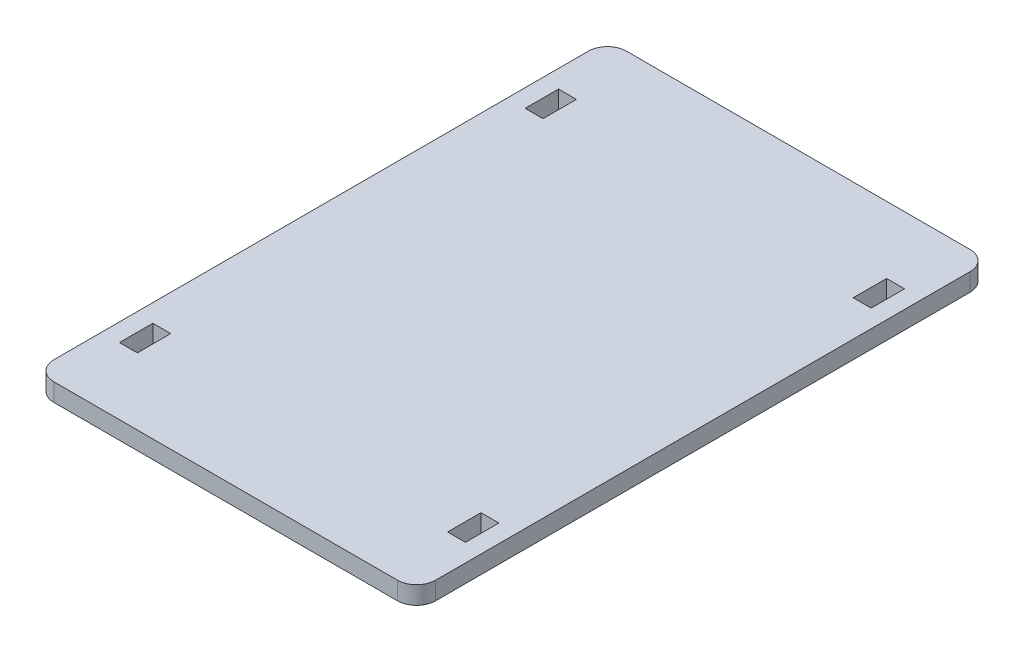
ISO-10303-21;
HEADER;
FILE_DESCRIPTION(('STEP AP214'),'2;1');
FILE_NAME('part.step','',(''),(''),'','','');
FILE_SCHEMA(('AUTOMOTIVE_DESIGN { 1 0 10303 214 1 1 1 1 }'));
ENDSEC;
DATA;
#1=APPLICATION_CONTEXT('core data for automotive mechanical design processes');
#2=APPLICATION_PROTOCOL_DEFINITION('international standard','automotive_design',2000,#1);
#3=PRODUCT_CONTEXT('',#1,'mechanical');
#4=PRODUCT('Part','Part','',(#3));
#5=PRODUCT_RELATED_PRODUCT_CATEGORY('part','',(#4));
#6=PRODUCT_DEFINITION_FORMATION('','',#4);
#7=PRODUCT_DEFINITION_CONTEXT('part definition',#1,'design');
#8=PRODUCT_DEFINITION('design','',#6,#7);
#9=PRODUCT_DEFINITION_SHAPE('','',#8);
#10=(LENGTH_UNIT() NAMED_UNIT(*) SI_UNIT(.MILLI.,.METRE.));
#11=(NAMED_UNIT(*) PLANE_ANGLE_UNIT() SI_UNIT($,.RADIAN.));
#12=(NAMED_UNIT(*) SI_UNIT($,.STERADIAN.) SOLID_ANGLE_UNIT());
#13=UNCERTAINTY_MEASURE_WITH_UNIT(LENGTH_MEASURE(1.E-05),#10,'distance_accuracy_value','');
#14=(GEOMETRIC_REPRESENTATION_CONTEXT(3) GLOBAL_UNCERTAINTY_ASSIGNED_CONTEXT((#13)) GLOBAL_UNIT_ASSIGNED_CONTEXT((#10,
#11,#12)) REPRESENTATION_CONTEXT('',''));
#15=CARTESIAN_POINT('',(0.,0.,0.));
#16=DIRECTION('',(0.,0.,1.));
#17=DIRECTION('',(1.,0.,0.));
#18=AXIS2_PLACEMENT_3D('',#15,#16,#17);
#19=CARTESIAN_POINT('',(0.,4.7625,0.));
#20=DIRECTION('',(-1.,0.,0.));
#21=DIRECTION('',(0.,0.,1.));
#22=AXIS2_PLACEMENT_3D('',#19,#20,#21);
#23=PLANE('',#22);
#24=DIRECTION('',(0.,0.,-1.));
#25=VECTOR('',#24,1.);
#26=CARTESIAN_POINT('',(0.,0.,0.));
#27=LINE('',#26,#25);
#28=CARTESIAN_POINT('',(0.,0.,-5.08));
#29=VERTEX_POINT('',#28);
#30=CARTESIAN_POINT('',(0.,0.,-147.32));
#31=VERTEX_POINT('',#30);
#32=EDGE_CURVE('E319',#29,#31,#27,.T.);
#33=ORIENTED_EDGE('',*,*,#32,.T.);
#34=DIRECTION('',(0.,-1.,0.));
#35=VECTOR('',#34,1.);
#36=CARTESIAN_POINT('',(0.,4.7625,-147.32));
#37=LINE('',#36,#35);
#38=CARTESIAN_POINT('',(0.,4.7625,-147.32));
#39=VERTEX_POINT('',#38);
#40=EDGE_CURVE('E11',#31,#39,#37,.F.);
#41=ORIENTED_EDGE('',*,*,#40,.T.);
#42=DIRECTION('',(0.,0.,-1.));
#43=VECTOR('',#42,1.);
#44=CARTESIAN_POINT('',(0.,4.7625,0.));
#45=LINE('',#44,#43);
#46=CARTESIAN_POINT('',(0.,4.7625,-5.08));
#47=VERTEX_POINT('',#46);
#48=EDGE_CURVE('E329',#47,#39,#45,.T.);
#49=ORIENTED_EDGE('',*,*,#48,.F.);
#50=DIRECTION('',(0.,-1.,0.));
#51=VECTOR('',#50,1.);
#52=CARTESIAN_POINT('',(0.,0.,-5.08));
#53=LINE('',#52,#51);
#54=EDGE_CURVE('E47',#47,#29,#53,.T.);
#55=ORIENTED_EDGE('',*,*,#54,.T.);
#56=EDGE_LOOP('',(#33,#41,#49,#55));
#57=FACE_BOUND('',#56,.T.);
#58=ADVANCED_FACE('F38',(#57),#23,.F.);
#59=CARTESIAN_POINT('',(0.,4.7625,-152.4));
#60=DIRECTION('',(0.,0.,1.));
#61=DIRECTION('',(1.,0.,0.));
#62=AXIS2_PLACEMENT_3D('',#59,#60,#61);
#63=PLANE('',#62);
#64=DIRECTION('',(-1.,0.,0.));
#65=VECTOR('',#64,1.);
#66=CARTESIAN_POINT('',(0.,0.,-152.4));
#67=LINE('',#66,#65);
#68=CARTESIAN_POINT('',(-5.08,0.,-152.4));
#69=VERTEX_POINT('',#68);
#70=CARTESIAN_POINT('',(-96.52,0.,-152.4));
#71=VERTEX_POINT('',#70);
#72=EDGE_CURVE('E348',#69,#71,#67,.T.);
#73=ORIENTED_EDGE('',*,*,#72,.T.);
#74=DIRECTION('',(0.,-1.,0.));
#75=VECTOR('',#74,1.);
#76=CARTESIAN_POINT('',(-96.52,4.7625,-152.4));
#77=LINE('',#76,#75);
#78=CARTESIAN_POINT('',(-96.52,4.7625,-152.4));
#79=VERTEX_POINT('',#78);
#80=EDGE_CURVE('E54',#71,#79,#77,.F.);
#81=ORIENTED_EDGE('',*,*,#80,.T.);
#82=DIRECTION('',(-1.,0.,0.));
#83=VECTOR('',#82,1.);
#84=CARTESIAN_POINT('',(0.,4.7625,-152.4));
#85=LINE('',#84,#83);
#86=CARTESIAN_POINT('',(-5.08,4.7625,-152.4));
#87=VERTEX_POINT('',#86);
#88=EDGE_CURVE('E332',#87,#79,#85,.T.);
#89=ORIENTED_EDGE('',*,*,#88,.F.);
#90=DIRECTION('',(0.,-1.,0.));
#91=VECTOR('',#90,1.);
#92=CARTESIAN_POINT('',(-5.08,4.7625,-152.4));
#93=LINE('',#92,#91);
#94=EDGE_CURVE('E455',#87,#69,#93,.T.);
#95=ORIENTED_EDGE('',*,*,#94,.T.);
#96=EDGE_LOOP('',(#73,#81,#89,#95));
#97=FACE_BOUND('',#96,.T.);
#98=ADVANCED_FACE('F477',(#97),#63,.F.);
#99=CARTESIAN_POINT('',(-101.6,4.7625,0.));
#100=DIRECTION('',(-1.,0.,0.));
#101=DIRECTION('',(0.,0.,1.));
#102=AXIS2_PLACEMENT_3D('',#99,#100,#101);
#103=PLANE('',#102);
#104=DIRECTION('',(0.,0.,-1.));
#105=VECTOR('',#104,1.);
#106=CARTESIAN_POINT('',(-101.6,0.,0.));
#107=LINE('',#106,#105);
#108=CARTESIAN_POINT('',(-101.6,0.,-5.08));
#109=VERTEX_POINT('',#108);
#110=CARTESIAN_POINT('',(-101.6,0.,-147.32));
#111=VERTEX_POINT('',#110);
#112=EDGE_CURVE('E351',#109,#111,#107,.T.);
#113=ORIENTED_EDGE('',*,*,#112,.F.);
#114=DIRECTION('',(0.,-1.,0.));
#115=VECTOR('',#114,1.);
#116=CARTESIAN_POINT('',(-101.6,4.7625,-5.08));
#117=LINE('',#116,#115);
#118=CARTESIAN_POINT('',(-101.6,4.7625,-5.08));
#119=VERTEX_POINT('',#118);
#120=EDGE_CURVE('E441',#109,#119,#117,.F.);
#121=ORIENTED_EDGE('',*,*,#120,.T.);
#122=DIRECTION('',(0.,0.,-1.));
#123=VECTOR('',#122,1.);
#124=CARTESIAN_POINT('',(-101.6,4.7625,0.));
#125=LINE('',#124,#123);
#126=CARTESIAN_POINT('',(-101.6,4.7625,-147.32));
#127=VERTEX_POINT('',#126);
#128=EDGE_CURVE('E336',#119,#127,#125,.T.);
#129=ORIENTED_EDGE('',*,*,#128,.T.);
#130=DIRECTION('',(0.,-1.,0.));
#131=VECTOR('',#130,1.);
#132=CARTESIAN_POINT('',(-101.6,0.,-147.32));
#133=LINE('',#132,#131);
#134=EDGE_CURVE('E437',#127,#111,#133,.T.);
#135=ORIENTED_EDGE('',*,*,#134,.T.);
#136=EDGE_LOOP('',(#113,#121,#129,#135));
#137=FACE_BOUND('',#136,.T.);
#138=ADVANCED_FACE('F485',(#137),#103,.T.);
#139=CARTESIAN_POINT('',(0.,4.7625,0.));
#140=DIRECTION('',(0.,0.,1.));
#141=DIRECTION('',(1.,0.,0.));
#142=AXIS2_PLACEMENT_3D('',#139,#140,#141);
#143=PLANE('',#142);
#144=DIRECTION('',(-1.,0.,0.));
#145=VECTOR('',#144,1.);
#146=CARTESIAN_POINT('',(0.,4.7625,0.));
#147=LINE('',#146,#145);
#148=CARTESIAN_POINT('',(-5.08,4.7625,0.));
#149=VERTEX_POINT('',#148);
#150=CARTESIAN_POINT('',(-96.52,4.7625,0.));
#151=VERTEX_POINT('',#150);
#152=EDGE_CURVE('E340',#149,#151,#147,.T.);
#153=ORIENTED_EDGE('',*,*,#152,.T.);
#154=DIRECTION('',(0.,-1.,0.));
#155=VECTOR('',#154,1.);
#156=CARTESIAN_POINT('',(-96.52,4.7625,0.));
#157=LINE('',#156,#155);
#158=CARTESIAN_POINT('',(-96.52,0.,0.));
#159=VERTEX_POINT('',#158);
#160=EDGE_CURVE('E421',#151,#159,#157,.T.);
#161=ORIENTED_EDGE('',*,*,#160,.T.);
#162=DIRECTION('',(-1.,0.,0.));
#163=VECTOR('',#162,1.);
#164=CARTESIAN_POINT('',(0.,0.,0.));
#165=LINE('',#164,#163);
#166=CARTESIAN_POINT('',(-5.08,0.,0.));
#167=VERTEX_POINT('',#166);
#168=EDGE_CURVE('E333',#167,#159,#165,.T.);
#169=ORIENTED_EDGE('',*,*,#168,.F.);
#170=DIRECTION('',(0.,-1.,0.));
#171=VECTOR('',#170,1.);
#172=CARTESIAN_POINT('',(-5.08,4.7625,0.));
#173=LINE('',#172,#171);
#174=EDGE_CURVE('E418',#167,#149,#173,.F.);
#175=ORIENTED_EDGE('',*,*,#174,.T.);
#176=EDGE_LOOP('',(#153,#161,#169,#175));
#177=FACE_BOUND('',#176,.T.);
#178=ADVANCED_FACE('F492',(#177),#143,.T.);
#179=CARTESIAN_POINT('',(0.,4.7625,0.));
#180=DIRECTION('',(0.,1.,0.));
#181=DIRECTION('',(0.,0.,1.));
#182=AXIS2_PLACEMENT_3D('',#179,#180,#181);
#183=PLANE('',#182);
#184=DIRECTION('',(0.,0.,1.));
#185=VECTOR('',#184,1.);
#186=CARTESIAN_POINT('',(-96.8375,4.7625,-134.62));
#187=LINE('',#186,#185);
#188=CARTESIAN_POINT('',(-96.8375,4.7625,-134.62));
#189=VERTEX_POINT('',#188);
#190=CARTESIAN_POINT('',(-96.8375,4.7625,-125.73));
#191=VERTEX_POINT('',#190);
#192=EDGE_CURVE('E245',#189,#191,#187,.T.);
#193=ORIENTED_EDGE('',*,*,#192,.F.);
#194=DIRECTION('',(-1.,0.,0.));
#195=VECTOR('',#194,1.);
#196=CARTESIAN_POINT('',(-96.8375,4.7625,-134.62));
#197=LINE('',#196,#195);
#198=CARTESIAN_POINT('',(-92.075,4.7625,-134.62));
#199=VERTEX_POINT('',#198);
#200=EDGE_CURVE('E257',#199,#189,#197,.T.);
#201=ORIENTED_EDGE('',*,*,#200,.F.);
#202=DIRECTION('',(0.,0.,-1.));
#203=VECTOR('',#202,1.);
#204=CARTESIAN_POINT('',(-92.075,4.7625,-134.62));
#205=LINE('',#204,#203);
#206=CARTESIAN_POINT('',(-92.075,4.7625,-125.73));
#207=VERTEX_POINT('',#206);
#208=EDGE_CURVE('E253',#207,#199,#205,.T.);
#209=ORIENTED_EDGE('',*,*,#208,.F.);
#210=DIRECTION('',(1.,0.,0.));
#211=VECTOR('',#210,1.);
#212=CARTESIAN_POINT('',(-96.8375,4.7625,-125.73));
#213=LINE('',#212,#211);
#214=EDGE_CURVE('E248',#191,#207,#213,.T.);
#215=ORIENTED_EDGE('',*,*,#214,.F.);
#216=EDGE_LOOP('',(#193,#201,#209,#215));
#217=FACE_BOUND('',#216,.T.);
#218=DIRECTION('',(0.,0.,-1.));
#219=VECTOR('',#218,1.);
#220=CARTESIAN_POINT('',(-4.76249999999998,4.7625,-17.78));
#221=LINE('',#220,#219);
#222=CARTESIAN_POINT('',(-4.76249999999998,4.7625,-17.78));
#223=VERTEX_POINT('',#222);
#224=CARTESIAN_POINT('',(-4.7625,4.7625,-26.67));
#225=VERTEX_POINT('',#224);
#226=EDGE_CURVE('E240',#223,#225,#221,.T.);
#227=ORIENTED_EDGE('',*,*,#226,.F.);
#228=DIRECTION('',(1.,0.,0.));
#229=VECTOR('',#228,1.);
#230=CARTESIAN_POINT('',(-4.76249999999998,4.7625,-17.78));
#231=LINE('',#230,#229);
#232=CARTESIAN_POINT('',(-9.52499999999996,4.7625,-17.78));
#233=VERTEX_POINT('',#232);
#234=EDGE_CURVE('E285',#233,#223,#231,.T.);
#235=ORIENTED_EDGE('',*,*,#234,.F.);
#236=DIRECTION('',(0.,0.,1.));
#237=VECTOR('',#236,1.);
#238=CARTESIAN_POINT('',(-9.52499999999996,4.7625,-17.78));
#239=LINE('',#238,#237);
#240=CARTESIAN_POINT('',(-9.52499999999998,4.7625,-26.67));
#241=VERTEX_POINT('',#240);
#242=EDGE_CURVE('E281',#241,#233,#239,.T.);
#243=ORIENTED_EDGE('',*,*,#242,.F.);
#244=DIRECTION('',(-1.,0.,0.));
#245=VECTOR('',#244,1.);
#246=CARTESIAN_POINT('',(-4.7625,4.7625,-26.67));
#247=LINE('',#246,#245);
#248=EDGE_CURVE('E277',#225,#241,#247,.T.);
#249=ORIENTED_EDGE('',*,*,#248,.F.);
#250=EDGE_LOOP('',(#227,#235,#243,#249));
#251=FACE_BOUND('',#250,.T.);
#252=DIRECTION('',(1.,0.,0.));
#253=VECTOR('',#252,1.);
#254=CARTESIAN_POINT('',(-96.8375,4.7625,-17.78));
#255=LINE('',#254,#253);
#256=CARTESIAN_POINT('',(-96.8375,4.7625,-17.78));
#257=VERTEX_POINT('',#256);
#258=CARTESIAN_POINT('',(-92.075,4.7625,-17.78));
#259=VERTEX_POINT('',#258);
#260=EDGE_CURVE('E224',#257,#259,#255,.T.);
#261=ORIENTED_EDGE('',*,*,#260,.F.);
#262=DIRECTION('',(0.,0.,1.));
#263=VECTOR('',#262,1.);
#264=CARTESIAN_POINT('',(-96.8375,4.7625,-17.78));
#265=LINE('',#264,#263);
#266=CARTESIAN_POINT('',(-96.8375,4.7625,-26.67));
#267=VERTEX_POINT('',#266);
#268=EDGE_CURVE('E229',#267,#257,#265,.T.);
#269=ORIENTED_EDGE('',*,*,#268,.F.);
#270=DIRECTION('',(-1.,0.,0.));
#271=VECTOR('',#270,1.);
#272=CARTESIAN_POINT('',(-96.8375,4.7625,-26.67));
#273=LINE('',#272,#271);
#274=CARTESIAN_POINT('',(-92.075,4.7625,-26.67));
#275=VERTEX_POINT('',#274);
#276=EDGE_CURVE('E206',#275,#267,#273,.T.);
#277=ORIENTED_EDGE('',*,*,#276,.F.);
#278=DIRECTION('',(0.,0.,-1.));
#279=VECTOR('',#278,1.);
#280=CARTESIAN_POINT('',(-92.075,4.7625,-17.78));
#281=LINE('',#280,#279);
#282=EDGE_CURVE('E218',#259,#275,#281,.T.);
#283=ORIENTED_EDGE('',*,*,#282,.F.);
#284=EDGE_LOOP('',(#261,#269,#277,#283));
#285=FACE_BOUND('',#284,.T.);
#286=DIRECTION('',(0.,0.,-1.));
#287=VECTOR('',#286,1.);
#288=CARTESIAN_POINT('',(-4.7625,4.7625,-134.62));
#289=LINE('',#288,#287);
#290=CARTESIAN_POINT('',(-4.7625,4.7625,-125.73));
#291=VERTEX_POINT('',#290);
#292=CARTESIAN_POINT('',(-4.7625,4.7625,-134.62));
#293=VERTEX_POINT('',#292);
#294=EDGE_CURVE('E265',#291,#293,#289,.T.);
#295=ORIENTED_EDGE('',*,*,#294,.F.);
#296=DIRECTION('',(1.,0.,0.));
#297=VECTOR('',#296,1.);
#298=CARTESIAN_POINT('',(-4.7625,4.7625,-125.73));
#299=LINE('',#298,#297);
#300=CARTESIAN_POINT('',(-9.525,4.7625,-125.73));
#301=VERTEX_POINT('',#300);
#302=EDGE_CURVE('E311',#301,#291,#299,.T.);
#303=ORIENTED_EDGE('',*,*,#302,.F.);
#304=DIRECTION('',(0.,0.,1.));
#305=VECTOR('',#304,1.);
#306=CARTESIAN_POINT('',(-9.525,4.7625,-134.62));
#307=LINE('',#306,#305);
#308=CARTESIAN_POINT('',(-9.525,4.7625,-134.62));
#309=VERTEX_POINT('',#308);
#310=EDGE_CURVE('E307',#309,#301,#307,.T.);
#311=ORIENTED_EDGE('',*,*,#310,.F.);
#312=DIRECTION('',(-1.,0.,0.));
#313=VECTOR('',#312,1.);
#314=CARTESIAN_POINT('',(-4.7625,4.7625,-134.62));
#315=LINE('',#314,#313);
#316=EDGE_CURVE('E303',#293,#309,#315,.T.);
#317=ORIENTED_EDGE('',*,*,#316,.F.);
#318=EDGE_LOOP('',(#295,#303,#311,#317));
#319=FACE_BOUND('',#318,.T.);
#320=ORIENTED_EDGE('',*,*,#128,.F.);
#321=CARTESIAN_POINT('',(-96.52,4.7625,-5.08));
#322=DIRECTION('',(0.,1.,0.));
#323=DIRECTION('',(0.,0.,1.));
#324=AXIS2_PLACEMENT_3D('',#321,#322,#323);
#325=CIRCLE('',#324,5.08);
#326=EDGE_CURVE('E452',#119,#151,#325,.T.);
#327=ORIENTED_EDGE('',*,*,#326,.T.);
#328=ORIENTED_EDGE('',*,*,#152,.F.);
#329=CARTESIAN_POINT('',(-5.08,4.7625,-5.08));
#330=DIRECTION('',(0.,1.,0.));
#331=DIRECTION('',(0.,0.,1.));
#332=AXIS2_PLACEMENT_3D('',#329,#330,#331);
#333=CIRCLE('',#332,5.08);
#334=EDGE_CURVE('E444',#149,#47,#333,.T.);
#335=ORIENTED_EDGE('',*,*,#334,.T.);
#336=ORIENTED_EDGE('',*,*,#48,.T.);
#337=CARTESIAN_POINT('',(-5.08,4.7625,-147.32));
#338=DIRECTION('',(0.,1.,0.));
#339=DIRECTION('',(0.,0.,1.));
#340=AXIS2_PLACEMENT_3D('',#337,#338,#339);
#341=CIRCLE('',#340,5.08);
#342=EDGE_CURVE('E61',#39,#87,#341,.T.);
#343=ORIENTED_EDGE('',*,*,#342,.T.);
#344=ORIENTED_EDGE('',*,*,#88,.T.);
#345=CARTESIAN_POINT('',(-96.52,4.7625,-147.32));
#346=DIRECTION('',(0.,1.,0.));
#347=DIRECTION('',(0.,0.,1.));
#348=AXIS2_PLACEMENT_3D('',#345,#346,#347);
#349=CIRCLE('',#348,5.08);
#350=EDGE_CURVE('E449',#79,#127,#349,.T.);
#351=ORIENTED_EDGE('',*,*,#350,.T.);
#352=EDGE_LOOP('',(#320,#327,#328,#335,#336,#343,#344,#351));
#353=FACE_BOUND('',#352,.T.);
#354=ADVANCED_FACE('F226',(#217,#251,#285,#319,#353),#183,.T.);
#355=CARTESIAN_POINT('',(0.,0.,0.));
#356=DIRECTION('',(0.,1.,0.));
#357=DIRECTION('',(0.,0.,1.));
#358=AXIS2_PLACEMENT_3D('',#355,#356,#357);
#359=PLANE('',#358);
#360=DIRECTION('',(-1.,0.,0.));
#361=VECTOR('',#360,1.);
#362=CARTESIAN_POINT('',(-7.84557604068449E-13,0.,-134.620000000001));
#363=LINE('',#362,#361);
#364=CARTESIAN_POINT('',(-92.075,0.,-134.62));
#365=VERTEX_POINT('',#364);
#366=CARTESIAN_POINT('',(-96.8375,0.,-134.62));
#367=VERTEX_POINT('',#366);
#368=EDGE_CURVE('E410',#365,#367,#363,.T.);
#369=ORIENTED_EDGE('',*,*,#368,.T.);
#370=DIRECTION('',(0.,0.,1.));
#371=VECTOR('',#370,1.);
#372=CARTESIAN_POINT('',(-96.8375,0.,0.));
#373=LINE('',#372,#371);
#374=CARTESIAN_POINT('',(-96.8375,0.,-125.73));
#375=VERTEX_POINT('',#374);
#376=EDGE_CURVE('E414',#367,#375,#373,.T.);
#377=ORIENTED_EDGE('',*,*,#376,.T.);
#378=DIRECTION('',(1.,0.,0.));
#379=VECTOR('',#378,1.);
#380=CARTESIAN_POINT('',(0.,0.,-125.73));
#381=LINE('',#380,#379);
#382=CARTESIAN_POINT('',(-92.075,0.,-125.73));
#383=VERTEX_POINT('',#382);
#384=EDGE_CURVE('E402',#375,#383,#381,.T.);
#385=ORIENTED_EDGE('',*,*,#384,.T.);
#386=DIRECTION('',(0.,0.,-1.));
#387=VECTOR('',#386,1.);
#388=CARTESIAN_POINT('',(-92.0749999999998,0.,1.43734230866649E-13));
#389=LINE('',#388,#387);
#390=EDGE_CURVE('E406',#383,#365,#389,.T.);
#391=ORIENTED_EDGE('',*,*,#390,.T.);
#392=EDGE_LOOP('',(#369,#377,#385,#391));
#393=FACE_BOUND('',#392,.T.);
#394=DIRECTION('',(1.,0.,0.));
#395=VECTOR('',#394,1.);
#396=CARTESIAN_POINT('',(-1.03620815631682E-13,0.,-17.78));
#397=LINE('',#396,#395);
#398=CARTESIAN_POINT('',(-9.52499999999996,0.,-17.78));
#399=VERTEX_POINT('',#398);
#400=CARTESIAN_POINT('',(-4.76249999999998,0.,-17.78));
#401=VERTEX_POINT('',#400);
#402=EDGE_CURVE('E394',#399,#401,#397,.T.);
#403=ORIENTED_EDGE('',*,*,#402,.T.);
#404=DIRECTION('',(0.,0.,-1.));
#405=VECTOR('',#404,1.);
#406=CARTESIAN_POINT('',(-4.76249999999993,0.,0.));
#407=LINE('',#406,#405);
#408=CARTESIAN_POINT('',(-4.7625,0.,-26.67));
#409=VERTEX_POINT('',#408);
#410=EDGE_CURVE('E398',#401,#409,#407,.T.);
#411=ORIENTED_EDGE('',*,*,#410,.T.);
#412=DIRECTION('',(-1.,0.,0.));
#413=VECTOR('',#412,1.);
#414=CARTESIAN_POINT('',(0.,0.,-26.67));
#415=LINE('',#414,#413);
#416=CARTESIAN_POINT('',(-9.52499999999998,0.,-26.67));
#417=VERTEX_POINT('',#416);
#418=EDGE_CURVE('E386',#409,#417,#415,.T.);
#419=ORIENTED_EDGE('',*,*,#418,.T.);
#420=DIRECTION('',(0.,0.,1.));
#421=VECTOR('',#420,1.);
#422=CARTESIAN_POINT('',(-9.52499999999994,0.,0.));
#423=LINE('',#422,#421);
#424=EDGE_CURVE('E390',#417,#399,#423,.T.);
#425=ORIENTED_EDGE('',*,*,#424,.T.);
#426=EDGE_LOOP('',(#403,#411,#419,#425));
#427=FACE_BOUND('',#426,.T.);
#428=DIRECTION('',(0.,0.,1.));
#429=VECTOR('',#428,1.);
#430=CARTESIAN_POINT('',(-96.8375,0.,-3.02337520098816E-13));
#431=LINE('',#430,#429);
#432=CARTESIAN_POINT('',(-96.8375,0.,-26.67));
#433=VERTEX_POINT('',#432);
#434=CARTESIAN_POINT('',(-96.8375,0.,-17.78));
#435=VERTEX_POINT('',#434);
#436=EDGE_CURVE('E378',#433,#435,#431,.T.);
#437=ORIENTED_EDGE('',*,*,#436,.T.);
#438=DIRECTION('',(1.,0.,0.));
#439=VECTOR('',#438,1.);
#440=CARTESIAN_POINT('',(1.03620815631678E-13,0.,-17.7799999999994));
#441=LINE('',#440,#439);
#442=CARTESIAN_POINT('',(-92.075,0.,-17.78));
#443=VERTEX_POINT('',#442);
#444=EDGE_CURVE('E382',#435,#443,#441,.T.);
#445=ORIENTED_EDGE('',*,*,#444,.T.);
#446=DIRECTION('',(0.,0.,-1.));
#447=VECTOR('',#446,1.);
#448=CARTESIAN_POINT('',(-92.075,0.,-1.4373423086665E-13));
#449=LINE('',#448,#447);
#450=CARTESIAN_POINT('',(-92.075,0.,-26.67));
#451=VERTEX_POINT('',#450);
#452=EDGE_CURVE('E373',#443,#451,#449,.T.);
#453=ORIENTED_EDGE('',*,*,#452,.T.);
#454=DIRECTION('',(-1.,0.,0.));
#455=VECTOR('',#454,1.);
#456=CARTESIAN_POINT('',(0.,0.,-26.6700000000002));
#457=LINE('',#456,#455);
#458=EDGE_CURVE('E209',#451,#433,#457,.T.);
#459=ORIENTED_EDGE('',*,*,#458,.T.);
#460=EDGE_LOOP('',(#437,#445,#453,#459));
#461=FACE_BOUND('',#460,.T.);
#462=DIRECTION('',(1.,0.,0.));
#463=VECTOR('',#462,1.);
#464=CARTESIAN_POINT('',(0.,0.,-125.73));
#465=LINE('',#464,#463);
#466=CARTESIAN_POINT('',(-9.525,0.,-125.73));
#467=VERTEX_POINT('',#466);
#468=CARTESIAN_POINT('',(-4.7625,0.,-125.73));
#469=VERTEX_POINT('',#468);
#470=EDGE_CURVE('E365',#467,#469,#465,.T.);
#471=ORIENTED_EDGE('',*,*,#470,.T.);
#472=DIRECTION('',(0.,0.,-1.));
#473=VECTOR('',#472,1.);
#474=CARTESIAN_POINT('',(-4.76249999999999,0.,0.));
#475=LINE('',#474,#473);
#476=CARTESIAN_POINT('',(-4.7625,0.,-134.62));
#477=VERTEX_POINT('',#476);
#478=EDGE_CURVE('E369',#469,#477,#475,.T.);
#479=ORIENTED_EDGE('',*,*,#478,.T.);
#480=DIRECTION('',(-1.,0.,0.));
#481=VECTOR('',#480,1.);
#482=CARTESIAN_POINT('',(7.84557604068444E-13,0.,-134.62));
#483=LINE('',#482,#481);
#484=CARTESIAN_POINT('',(-9.525,0.,-134.62));
#485=VERTEX_POINT('',#484);
#486=EDGE_CURVE('E344',#477,#485,#483,.T.);
#487=ORIENTED_EDGE('',*,*,#486,.T.);
#488=DIRECTION('',(0.,0.,1.));
#489=VECTOR('',#488,1.);
#490=CARTESIAN_POINT('',(-9.52499999999997,0.,0.));
#491=LINE('',#490,#489);
#492=EDGE_CURVE('E361',#485,#467,#491,.T.);
#493=ORIENTED_EDGE('',*,*,#492,.T.);
#494=EDGE_LOOP('',(#471,#479,#487,#493));
#495=FACE_BOUND('',#494,.T.);
#496=ORIENTED_EDGE('',*,*,#168,.T.);
#497=CARTESIAN_POINT('',(-96.52,0.,-5.08));
#498=DIRECTION('',(0.,1.,0.));
#499=DIRECTION('',(0.,0.,1.));
#500=AXIS2_PLACEMENT_3D('',#497,#498,#499);
#501=CIRCLE('',#500,5.08);
#502=EDGE_CURVE('E434',#159,#109,#501,.F.);
#503=ORIENTED_EDGE('',*,*,#502,.T.);
#504=ORIENTED_EDGE('',*,*,#112,.T.);
#505=CARTESIAN_POINT('',(-96.52,0.,-147.32));
#506=DIRECTION('',(0.,1.,0.));
#507=DIRECTION('',(0.,0.,1.));
#508=AXIS2_PLACEMENT_3D('',#505,#506,#507);
#509=CIRCLE('',#508,5.08);
#510=EDGE_CURVE('E431',#111,#71,#509,.F.);
#511=ORIENTED_EDGE('',*,*,#510,.T.);
#512=ORIENTED_EDGE('',*,*,#72,.F.);
#513=CARTESIAN_POINT('',(-5.08,0.,-147.32));
#514=DIRECTION('',(0.,1.,0.));
#515=DIRECTION('',(0.,0.,1.));
#516=AXIS2_PLACEMENT_3D('',#513,#514,#515);
#517=CIRCLE('',#516,5.08);
#518=EDGE_CURVE('E428',#69,#31,#517,.F.);
#519=ORIENTED_EDGE('',*,*,#518,.T.);
#520=ORIENTED_EDGE('',*,*,#32,.F.);
#521=CARTESIAN_POINT('',(-5.08,0.,-5.08));
#522=DIRECTION('',(0.,1.,0.));
#523=DIRECTION('',(0.,0.,1.));
#524=AXIS2_PLACEMENT_3D('',#521,#522,#523);
#525=CIRCLE('',#524,5.08);
#526=EDGE_CURVE('E425',#29,#167,#525,.F.);
#527=ORIENTED_EDGE('',*,*,#526,.T.);
#528=EDGE_LOOP('',(#496,#503,#504,#511,#512,#519,#520,#527));
#529=FACE_BOUND('',#528,.T.);
#530=ADVANCED_FACE('F471',(#393,#427,#461,#495,#529),#359,.F.);
#531=CARTESIAN_POINT('',(-4.7625,-1.5875,-134.62));
#532=DIRECTION('',(1.,0.,0.));
#533=DIRECTION('',(0.,0.,-1.));
#534=AXIS2_PLACEMENT_3D('',#531,#532,#533);
#535=PLANE('',#534);
#536=DIRECTION('',(0.,1.,0.));
#537=VECTOR('',#536,1.);
#538=CARTESIAN_POINT('',(-4.7625,-1.5875,-125.73));
#539=LINE('',#538,#537);
#540=EDGE_CURVE('E316',#469,#291,#539,.T.);
#541=ORIENTED_EDGE('',*,*,#540,.T.);
#542=ORIENTED_EDGE('',*,*,#294,.T.);
#543=DIRECTION('',(0.,1.,0.));
#544=VECTOR('',#543,1.);
#545=CARTESIAN_POINT('',(-4.7625,-1.5875,-134.62));
#546=LINE('',#545,#544);
#547=EDGE_CURVE('E315',#477,#293,#546,.T.);
#548=ORIENTED_EDGE('',*,*,#547,.F.);
#549=ORIENTED_EDGE('',*,*,#478,.F.);
#550=EDGE_LOOP('',(#541,#542,#548,#549));
#551=FACE_BOUND('',#550,.T.);
#552=ADVANCED_FACE('F684',(#551),#535,.F.);
#553=CARTESIAN_POINT('',(-4.7625,-1.5875,-125.73));
#554=DIRECTION('',(0.,0.,1.));
#555=DIRECTION('',(1.,0.,0.));
#556=AXIS2_PLACEMENT_3D('',#553,#554,#555);
#557=PLANE('',#556);
#558=DIRECTION('',(0.,1.,0.));
#559=VECTOR('',#558,1.);
#560=CARTESIAN_POINT('',(-9.525,-1.5875,-125.73));
#561=LINE('',#560,#559);
#562=EDGE_CURVE('E320',#467,#301,#561,.T.);
#563=ORIENTED_EDGE('',*,*,#562,.T.);
#564=ORIENTED_EDGE('',*,*,#302,.T.);
#565=ORIENTED_EDGE('',*,*,#540,.F.);
#566=ORIENTED_EDGE('',*,*,#470,.F.);
#567=EDGE_LOOP('',(#563,#564,#565,#566));
#568=FACE_BOUND('',#567,.T.);
#569=ADVANCED_FACE('F674',(#568),#557,.F.);
#570=CARTESIAN_POINT('',(-9.525,-1.5875,-134.62));
#571=DIRECTION('',(-1.,0.,0.));
#572=DIRECTION('',(0.,0.,1.));
#573=AXIS2_PLACEMENT_3D('',#570,#571,#572);
#574=PLANE('',#573);
#575=DIRECTION('',(0.,1.,0.));
#576=VECTOR('',#575,1.);
#577=CARTESIAN_POINT('',(-9.525,-1.5875,-134.62));
#578=LINE('',#577,#576);
#579=EDGE_CURVE('E323',#485,#309,#578,.T.);
#580=ORIENTED_EDGE('',*,*,#579,.T.);
#581=ORIENTED_EDGE('',*,*,#310,.T.);
#582=ORIENTED_EDGE('',*,*,#562,.F.);
#583=ORIENTED_EDGE('',*,*,#492,.F.);
#584=EDGE_LOOP('',(#580,#581,#582,#583));
#585=FACE_BOUND('',#584,.T.);
#586=ADVANCED_FACE('F664',(#585),#574,.F.);
#587=CARTESIAN_POINT('',(-4.7625,-1.5875,-134.62));
#588=DIRECTION('',(0.,0.,-1.));
#589=DIRECTION('',(-1.,0.,0.));
#590=AXIS2_PLACEMENT_3D('',#587,#588,#589);
#591=PLANE('',#590);
#592=ORIENTED_EDGE('',*,*,#547,.T.);
#593=ORIENTED_EDGE('',*,*,#316,.T.);
#594=ORIENTED_EDGE('',*,*,#579,.F.);
#595=ORIENTED_EDGE('',*,*,#486,.F.);
#596=EDGE_LOOP('',(#592,#593,#594,#595));
#597=FACE_BOUND('',#596,.T.);
#598=ADVANCED_FACE('F654',(#597),#591,.F.);
#599=CARTESIAN_POINT('',(-96.8375,-1.5875,-17.78));
#600=DIRECTION('',(0.,0.,1.));
#601=DIRECTION('',(1.,0.,0.));
#602=AXIS2_PLACEMENT_3D('',#599,#600,#601);
#603=PLANE('',#602);
#604=DIRECTION('',(0.,1.,0.));
#605=VECTOR('',#604,1.);
#606=CARTESIAN_POINT('',(-96.8375,-1.5875,-17.78));
#607=LINE('',#606,#605);
#608=EDGE_CURVE('E237',#435,#257,#607,.T.);
#609=ORIENTED_EDGE('',*,*,#608,.T.);
#610=ORIENTED_EDGE('',*,*,#260,.T.);
#611=DIRECTION('',(0.,1.,0.));
#612=VECTOR('',#611,1.);
#613=CARTESIAN_POINT('',(-92.075,-1.5875,-17.78));
#614=LINE('',#613,#612);
#615=EDGE_CURVE('E214',#443,#259,#614,.T.);
#616=ORIENTED_EDGE('',*,*,#615,.F.);
#617=ORIENTED_EDGE('',*,*,#444,.F.);
#618=EDGE_LOOP('',(#609,#610,#616,#617));
#619=FACE_BOUND('',#618,.T.);
#620=ADVANCED_FACE('F644',(#619),#603,.F.);
#621=CARTESIAN_POINT('',(-96.8375,-1.5875,-17.78));
#622=DIRECTION('',(-1.,0.,0.));
#623=DIRECTION('',(0.,0.,1.));
#624=AXIS2_PLACEMENT_3D('',#621,#622,#623);
#625=PLANE('',#624);
#626=DIRECTION('',(0.,1.,0.));
#627=VECTOR('',#626,1.);
#628=CARTESIAN_POINT('',(-96.8375,-1.5875,-26.67));
#629=LINE('',#628,#627);
#630=EDGE_CURVE('E213',#433,#267,#629,.T.);
#631=ORIENTED_EDGE('',*,*,#630,.T.);
#632=ORIENTED_EDGE('',*,*,#268,.T.);
#633=ORIENTED_EDGE('',*,*,#608,.F.);
#634=ORIENTED_EDGE('',*,*,#436,.F.);
#635=EDGE_LOOP('',(#631,#632,#633,#634));
#636=FACE_BOUND('',#635,.T.);
#637=ADVANCED_FACE('F635',(#636),#625,.F.);
#638=CARTESIAN_POINT('',(-96.8375,-1.5875,-26.67));
#639=DIRECTION('',(0.,0.,-1.));
#640=DIRECTION('',(-1.,0.,0.));
#641=AXIS2_PLACEMENT_3D('',#638,#639,#640);
#642=PLANE('',#641);
#643=DIRECTION('',(0.,1.,0.));
#644=VECTOR('',#643,1.);
#645=CARTESIAN_POINT('',(-92.075,-1.5875,-26.67));
#646=LINE('',#645,#644);
#647=EDGE_CURVE('E201',#451,#275,#646,.T.);
#648=ORIENTED_EDGE('',*,*,#647,.T.);
#649=ORIENTED_EDGE('',*,*,#276,.T.);
#650=ORIENTED_EDGE('',*,*,#630,.F.);
#651=ORIENTED_EDGE('',*,*,#458,.F.);
#652=EDGE_LOOP('',(#648,#649,#650,#651));
#653=FACE_BOUND('',#652,.T.);
#654=ADVANCED_FACE('F203',(#653),#642,.F.);
#655=CARTESIAN_POINT('',(-92.075,-1.5875,-17.78));
#656=DIRECTION('',(1.,0.,0.));
#657=DIRECTION('',(0.,0.,-1.));
#658=AXIS2_PLACEMENT_3D('',#655,#656,#657);
#659=PLANE('',#658);
#660=ORIENTED_EDGE('',*,*,#615,.T.);
#661=ORIENTED_EDGE('',*,*,#282,.T.);
#662=ORIENTED_EDGE('',*,*,#647,.F.);
#663=ORIENTED_EDGE('',*,*,#452,.F.);
#664=EDGE_LOOP('',(#660,#661,#662,#663));
#665=FACE_BOUND('',#664,.T.);
#666=ADVANCED_FACE('F219',(#665),#659,.F.);
#667=CARTESIAN_POINT('',(-4.76249999999998,-1.5875,-17.78));
#668=DIRECTION('',(1.,0.,0.));
#669=DIRECTION('',(0.,0.,-1.));
#670=AXIS2_PLACEMENT_3D('',#667,#668,#669);
#671=PLANE('',#670);
#672=DIRECTION('',(0.,1.,0.));
#673=VECTOR('',#672,1.);
#674=CARTESIAN_POINT('',(-4.76249999999998,-1.5875,-17.78));
#675=LINE('',#674,#673);
#676=EDGE_CURVE('E249',#401,#223,#675,.T.);
#677=ORIENTED_EDGE('',*,*,#676,.T.);
#678=ORIENTED_EDGE('',*,*,#226,.T.);
#679=DIRECTION('',(0.,1.,0.));
#680=VECTOR('',#679,1.);
#681=CARTESIAN_POINT('',(-4.7625,-1.5875,-26.67));
#682=LINE('',#681,#680);
#683=EDGE_CURVE('E289',#409,#225,#682,.T.);
#684=ORIENTED_EDGE('',*,*,#683,.F.);
#685=ORIENTED_EDGE('',*,*,#410,.F.);
#686=EDGE_LOOP('',(#677,#678,#684,#685));
#687=FACE_BOUND('',#686,.T.);
#688=ADVANCED_FACE('F608',(#687),#671,.F.);
#689=CARTESIAN_POINT('',(-4.76249999999998,-1.5875,-17.78));
#690=DIRECTION('',(0.,0.,1.));
#691=DIRECTION('',(1.,0.,0.));
#692=AXIS2_PLACEMENT_3D('',#689,#690,#691);
#693=PLANE('',#692);
#694=DIRECTION('',(0.,1.,0.));
#695=VECTOR('',#694,1.);
#696=CARTESIAN_POINT('',(-9.52499999999996,-1.5875,-17.78));
#697=LINE('',#696,#695);
#698=EDGE_CURVE('E292',#399,#233,#697,.T.);
#699=ORIENTED_EDGE('',*,*,#698,.T.);
#700=ORIENTED_EDGE('',*,*,#234,.T.);
#701=ORIENTED_EDGE('',*,*,#676,.F.);
#702=ORIENTED_EDGE('',*,*,#402,.F.);
#703=EDGE_LOOP('',(#699,#700,#701,#702));
#704=FACE_BOUND('',#703,.T.);
#705=ADVANCED_FACE('F598',(#704),#693,.F.);
#706=CARTESIAN_POINT('',(-9.52499999999996,-1.5875,-17.78));
#707=DIRECTION('',(-1.,0.,0.));
#708=DIRECTION('',(0.,0.,1.));
#709=AXIS2_PLACEMENT_3D('',#706,#707,#708);
#710=PLANE('',#709);
#711=DIRECTION('',(0.,1.,0.));
#712=VECTOR('',#711,1.);
#713=CARTESIAN_POINT('',(-9.52499999999998,-1.5875,-26.67));
#714=LINE('',#713,#712);
#715=EDGE_CURVE('E295',#417,#241,#714,.T.);
#716=ORIENTED_EDGE('',*,*,#715,.T.);
#717=ORIENTED_EDGE('',*,*,#242,.T.);
#718=ORIENTED_EDGE('',*,*,#698,.F.);
#719=ORIENTED_EDGE('',*,*,#424,.F.);
#720=EDGE_LOOP('',(#716,#717,#718,#719));
#721=FACE_BOUND('',#720,.T.);
#722=ADVANCED_FACE('F588',(#721),#710,.F.);
#723=CARTESIAN_POINT('',(-4.7625,-1.5875,-26.67));
#724=DIRECTION('',(0.,0.,-1.));
#725=DIRECTION('',(-1.,0.,0.));
#726=AXIS2_PLACEMENT_3D('',#723,#724,#725);
#727=PLANE('',#726);
#728=ORIENTED_EDGE('',*,*,#683,.T.);
#729=ORIENTED_EDGE('',*,*,#248,.T.);
#730=ORIENTED_EDGE('',*,*,#715,.F.);
#731=ORIENTED_EDGE('',*,*,#418,.F.);
#732=EDGE_LOOP('',(#728,#729,#730,#731));
#733=FACE_BOUND('',#732,.T.);
#734=ADVANCED_FACE('F578',(#733),#727,.F.);
#735=CARTESIAN_POINT('',(-96.8375,-1.5875,-134.62));
#736=DIRECTION('',(-1.,0.,0.));
#737=DIRECTION('',(0.,0.,1.));
#738=AXIS2_PLACEMENT_3D('',#735,#736,#737);
#739=PLANE('',#738);
#740=DIRECTION('',(0.,1.,0.));
#741=VECTOR('',#740,1.);
#742=CARTESIAN_POINT('',(-96.8375,-1.5875,-134.62));
#743=LINE('',#742,#741);
#744=EDGE_CURVE('E262',#367,#189,#743,.T.);
#745=ORIENTED_EDGE('',*,*,#744,.T.);
#746=ORIENTED_EDGE('',*,*,#192,.T.);
#747=DIRECTION('',(0.,1.,0.));
#748=VECTOR('',#747,1.);
#749=CARTESIAN_POINT('',(-96.8375,-1.5875,-125.73));
#750=LINE('',#749,#748);
#751=EDGE_CURVE('E261',#375,#191,#750,.T.);
#752=ORIENTED_EDGE('',*,*,#751,.F.);
#753=ORIENTED_EDGE('',*,*,#376,.F.);
#754=EDGE_LOOP('',(#745,#746,#752,#753));
#755=FACE_BOUND('',#754,.T.);
#756=ADVANCED_FACE('F568',(#755),#739,.F.);
#757=CARTESIAN_POINT('',(-96.8375,-1.5875,-134.62));
#758=DIRECTION('',(0.,0.,-1.));
#759=DIRECTION('',(-1.,0.,0.));
#760=AXIS2_PLACEMENT_3D('',#757,#758,#759);
#761=PLANE('',#760);
#762=DIRECTION('',(0.,1.,0.));
#763=VECTOR('',#762,1.);
#764=CARTESIAN_POINT('',(-92.075,-1.5875,-134.62));
#765=LINE('',#764,#763);
#766=EDGE_CURVE('E266',#365,#199,#765,.T.);
#767=ORIENTED_EDGE('',*,*,#766,.T.);
#768=ORIENTED_EDGE('',*,*,#200,.T.);
#769=ORIENTED_EDGE('',*,*,#744,.F.);
#770=ORIENTED_EDGE('',*,*,#368,.F.);
#771=EDGE_LOOP('',(#767,#768,#769,#770));
#772=FACE_BOUND('',#771,.T.);
#773=ADVANCED_FACE('F558',(#772),#761,.F.);
#774=CARTESIAN_POINT('',(-92.075,-1.5875,-134.62));
#775=DIRECTION('',(1.,0.,0.));
#776=DIRECTION('',(0.,0.,-1.));
#777=AXIS2_PLACEMENT_3D('',#774,#775,#776);
#778=PLANE('',#777);
#779=DIRECTION('',(0.,1.,0.));
#780=VECTOR('',#779,1.);
#781=CARTESIAN_POINT('',(-92.075,-1.5875,-125.73));
#782=LINE('',#781,#780);
#783=EDGE_CURVE('E269',#383,#207,#782,.T.);
#784=ORIENTED_EDGE('',*,*,#783,.T.);
#785=ORIENTED_EDGE('',*,*,#208,.T.);
#786=ORIENTED_EDGE('',*,*,#766,.F.);
#787=ORIENTED_EDGE('',*,*,#390,.F.);
#788=EDGE_LOOP('',(#784,#785,#786,#787));
#789=FACE_BOUND('',#788,.T.);
#790=ADVANCED_FACE('F547',(#789),#778,.F.);
#791=CARTESIAN_POINT('',(-96.8375,-1.5875,-125.73));
#792=DIRECTION('',(0.,0.,1.));
#793=DIRECTION('',(1.,0.,0.));
#794=AXIS2_PLACEMENT_3D('',#791,#792,#793);
#795=PLANE('',#794);
#796=ORIENTED_EDGE('',*,*,#751,.T.);
#797=ORIENTED_EDGE('',*,*,#214,.T.);
#798=ORIENTED_EDGE('',*,*,#783,.F.);
#799=ORIENTED_EDGE('',*,*,#384,.F.);
#800=EDGE_LOOP('',(#796,#797,#798,#799));
#801=FACE_BOUND('',#800,.T.);
#802=ADVANCED_FACE('F509',(#801),#795,.F.);
#803=CARTESIAN_POINT('',(-96.52,4.7625,-5.08));
#804=DIRECTION('',(0.,-1.,0.));
#805=DIRECTION('',(0.,0.,-1.));
#806=AXIS2_PLACEMENT_3D('',#803,#804,#805);
#807=CYLINDRICAL_SURFACE('',#806,5.08);
#808=ORIENTED_EDGE('',*,*,#326,.F.);
#809=ORIENTED_EDGE('',*,*,#120,.F.);
#810=ORIENTED_EDGE('',*,*,#502,.F.);
#811=ORIENTED_EDGE('',*,*,#160,.F.);
#812=EDGE_LOOP('',(#808,#809,#810,#811));
#813=FACE_BOUND('',#812,.T.);
#814=ADVANCED_FACE('F490',(#813),#807,.T.);
#815=CARTESIAN_POINT('',(-96.52,4.7625,-147.32));
#816=DIRECTION('',(0.,1.,0.));
#817=DIRECTION('',(0.,0.,1.));
#818=AXIS2_PLACEMENT_3D('',#815,#816,#817);
#819=CYLINDRICAL_SURFACE('',#818,5.08);
#820=ORIENTED_EDGE('',*,*,#350,.F.);
#821=ORIENTED_EDGE('',*,*,#80,.F.);
#822=ORIENTED_EDGE('',*,*,#510,.F.);
#823=ORIENTED_EDGE('',*,*,#134,.F.);
#824=EDGE_LOOP('',(#820,#821,#822,#823));
#825=FACE_BOUND('',#824,.T.);
#826=ADVANCED_FACE('F482',(#825),#819,.T.);
#827=CARTESIAN_POINT('',(-5.08,4.7625,-147.32));
#828=DIRECTION('',(0.,-1.,0.));
#829=DIRECTION('',(0.,0.,-1.));
#830=AXIS2_PLACEMENT_3D('',#827,#828,#829);
#831=CYLINDRICAL_SURFACE('',#830,5.08);
#832=ORIENTED_EDGE('',*,*,#342,.F.);
#833=ORIENTED_EDGE('',*,*,#40,.F.);
#834=ORIENTED_EDGE('',*,*,#518,.F.);
#835=ORIENTED_EDGE('',*,*,#94,.F.);
#836=EDGE_LOOP('',(#832,#833,#834,#835));
#837=FACE_BOUND('',#836,.T.);
#838=ADVANCED_FACE('F476',(#837),#831,.T.);
#839=CARTESIAN_POINT('',(-5.08,4.7625,-5.08));
#840=DIRECTION('',(0.,1.,0.));
#841=DIRECTION('',(0.,0.,1.));
#842=AXIS2_PLACEMENT_3D('',#839,#840,#841);
#843=CYLINDRICAL_SURFACE('',#842,5.08);
#844=ORIENTED_EDGE('',*,*,#334,.F.);
#845=ORIENTED_EDGE('',*,*,#174,.F.);
#846=ORIENTED_EDGE('',*,*,#526,.F.);
#847=ORIENTED_EDGE('',*,*,#54,.F.);
#848=EDGE_LOOP('',(#844,#845,#846,#847));
#849=FACE_BOUND('',#848,.T.);
#850=ADVANCED_FACE('F40',(#849),#843,.T.);
#851=CLOSED_SHELL('',(#58,#98,#138,#178,#354,#530,#552,#569,#586,#598,#620,#637,#654,#666,#688,
#705,#722,#734,#756,#773,#790,#802,#814,#826,#838,#850));
#852=MANIFOLD_SOLID_BREP('B2',#851);
#853=ADVANCED_BREP_SHAPE_REPRESENTATION('',(#18,#852),#14);
#854=SHAPE_DEFINITION_REPRESENTATION(#9,#853);
ENDSEC;
END-ISO-10303-21;
